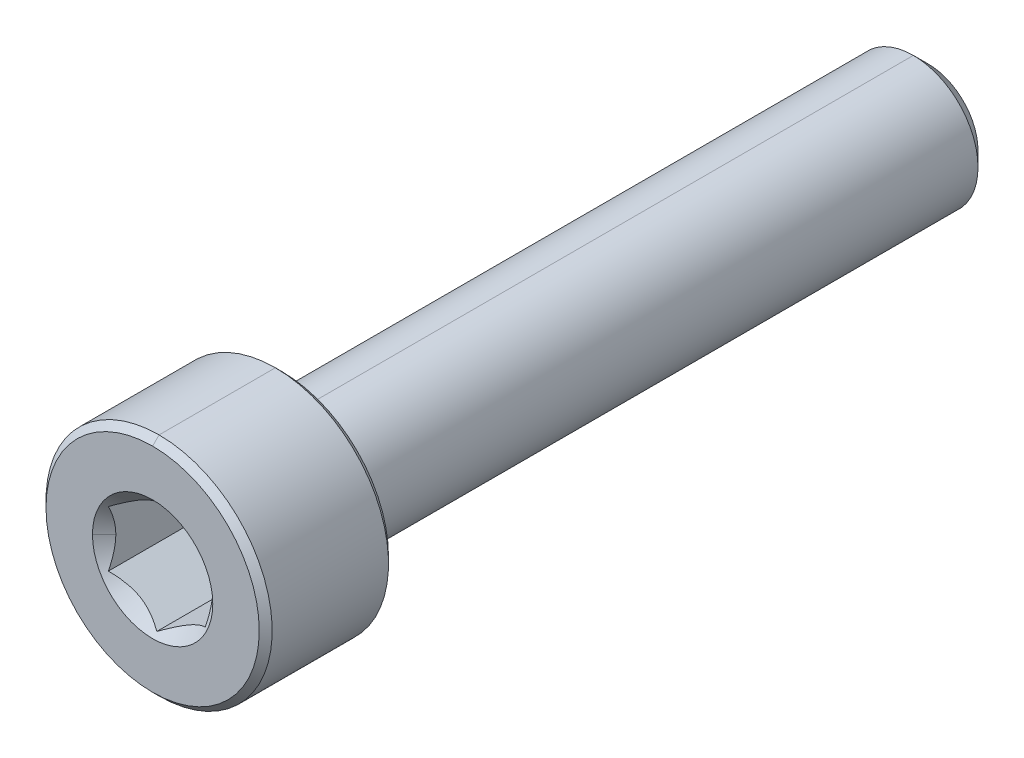
ISO-10303-21;
HEADER;
FILE_DESCRIPTION(('STEP AP214'),'2;1');
FILE_NAME('part.step','',(''),(''),'','','');
FILE_SCHEMA(('AUTOMOTIVE_DESIGN { 1 0 10303 214 1 1 1 1 }'));
ENDSEC;
DATA;
#1=APPLICATION_CONTEXT('core data for automotive mechanical design processes');
#2=APPLICATION_PROTOCOL_DEFINITION('international standard','automotive_design',2000,#1);
#3=PRODUCT_CONTEXT('',#1,'mechanical');
#4=PRODUCT('Part','Part','',(#3));
#5=PRODUCT_RELATED_PRODUCT_CATEGORY('part','',(#4));
#6=PRODUCT_DEFINITION_FORMATION('','',#4);
#7=PRODUCT_DEFINITION_CONTEXT('part definition',#1,'design');
#8=PRODUCT_DEFINITION('design','',#6,#7);
#9=PRODUCT_DEFINITION_SHAPE('','',#8);
#10=(LENGTH_UNIT() NAMED_UNIT(*) SI_UNIT(.MILLI.,.METRE.));
#11=(NAMED_UNIT(*) PLANE_ANGLE_UNIT() SI_UNIT($,.RADIAN.));
#12=(NAMED_UNIT(*) SI_UNIT($,.STERADIAN.) SOLID_ANGLE_UNIT());
#13=UNCERTAINTY_MEASURE_WITH_UNIT(LENGTH_MEASURE(1.E-05),#10,'distance_accuracy_value','');
#14=(GEOMETRIC_REPRESENTATION_CONTEXT(3) GLOBAL_UNCERTAINTY_ASSIGNED_CONTEXT((#13)) GLOBAL_UNIT_ASSIGNED_CONTEXT((#10,
#11,#12)) REPRESENTATION_CONTEXT('',''));
#15=CARTESIAN_POINT('',(0.,0.,0.));
#16=DIRECTION('',(0.,0.,1.));
#17=DIRECTION('',(1.,0.,0.));
#18=AXIS2_PLACEMENT_3D('',#15,#16,#17);
#19=CARTESIAN_POINT('',(1.5,-0.866025403784439,3.41742430504416));
#20=DIRECTION('',(1.,0.,0.));
#21=DIRECTION('',(0.,1.,0.));
#22=AXIS2_PLACEMENT_3D('',#19,#20,#21);
#23=PLANE('',#22);
#24=DIRECTION('',(0.,0.,1.));
#25=VECTOR('',#24,1.);
#26=CARTESIAN_POINT('',(1.5,-0.866025403784439,3.41742430504416));
#27=LINE('',#26,#25);
#28=CARTESIAN_POINT('',(1.5,-0.866025403784439,9.));
#29=VERTEX_POINT('',#28);
#30=CARTESIAN_POINT('',(1.5,-0.866025403784439,11.8700961894323));
#31=VERTEX_POINT('',#30);
#32=EDGE_CURVE('E280',#29,#31,#27,.T.);
#33=ORIENTED_EDGE('',*,*,#32,.T.);
#34=CARTESIAN_POINT('',(1.5,-0.866025403784439,11.8700961894323));
#35=CARTESIAN_POINT('',(1.5,-0.401923788646695,11.6380453818635));
#36=CARTESIAN_POINT('',(1.5,0.,11.6380453818635));
#37=B_SPLINE_CURVE_WITH_KNOTS('',2,(#34,#35,#36),.UNSPECIFIED.,.F.,.F.,(3,3),(0.,1.),.UNSPECIFIED.);
#38=CARTESIAN_POINT('',(1.5,0.,11.6380453818635));
#39=VERTEX_POINT('',#38);
#40=EDGE_CURVE('E343',#31,#39,#37,.T.);
#41=ORIENTED_EDGE('',*,*,#40,.T.);
#42=CARTESIAN_POINT('',(1.5,0.,11.6380453818635));
#43=CARTESIAN_POINT('',(1.5,0.216977558745861,11.6380453818635));
#44=CARTESIAN_POINT('',(1.5,0.445753418709853,11.7028763983924));
#45=CARTESIAN_POINT('',(1.5,0.643872918489836,11.759019946785));
#46=CARTESIAN_POINT('',(1.5,0.866025403784441,11.8700961894323));
#47=B_SPLINE_CURVE_WITH_KNOTS('',2,(#42,#43,#44,#45,#46),.UNSPECIFIED.,.F.,.F.,(3,2,3),(0.,0.5,
1.),.UNSPECIFIED.);
#48=CARTESIAN_POINT('',(1.5,0.866025403784439,11.8700961894323));
#49=VERTEX_POINT('',#48);
#50=EDGE_CURVE('E355',#39,#49,#47,.T.);
#51=ORIENTED_EDGE('',*,*,#50,.T.);
#52=DIRECTION('',(0.,0.,1.));
#53=VECTOR('',#52,1.);
#54=CARTESIAN_POINT('',(1.5,0.866025403784439,3.41742430504416));
#55=LINE('',#54,#53);
#56=CARTESIAN_POINT('',(1.5,0.866025403784439,9.));
#57=VERTEX_POINT('',#56);
#58=EDGE_CURVE('E10',#57,#49,#55,.T.);
#59=ORIENTED_EDGE('',*,*,#58,.F.);
#60=DIRECTION('',(0.,1.,0.));
#61=VECTOR('',#60,1.);
#62=CARTESIAN_POINT('',(1.5,-0.866025403784439,9.));
#63=LINE('',#62,#61);
#64=EDGE_CURVE('E852',#29,#57,#63,.T.);
#65=ORIENTED_EDGE('',*,*,#64,.F.);
#66=EDGE_LOOP('',(#33,#41,#51,#59,#65));
#67=FACE_BOUND('',#66,.T.);
#68=ADVANCED_FACE('F16',(#67),#23,.F.);
#69=CARTESIAN_POINT('',(1.5,0.866025403784439,3.41742430504416));
#70=DIRECTION('',(0.5,0.866025403784439,0.));
#71=DIRECTION('',(0.,0.,-1.));
#72=AXIS2_PLACEMENT_3D('',#69,#70,#71);
#73=PLANE('',#72);
#74=ORIENTED_EDGE('',*,*,#58,.T.);
#75=CARTESIAN_POINT('',(1.5,0.866025403784439,11.8700961894323));
#76=CARTESIAN_POINT('',(1.09983313245336,1.09706185248326,11.6390597407335));
#77=CARTESIAN_POINT('',(0.752762837135629,1.29744298091268,11.6380487744236));
#78=CARTESIAN_POINT('',(0.403679115743728,1.49898656142801,11.6370319432905));
#79=CARTESIAN_POINT('',(0.,1.73205080756888,11.8700961894323));
#80=B_SPLINE_CURVE_WITH_KNOTS('',2,(#75,#76,#77,#78,#79),.UNSPECIFIED.,.F.,.F.,(3,2,3),(0.,0.5,
1.),.UNSPECIFIED.);
#81=CARTESIAN_POINT('',(0.,1.73205080756888,11.8700961894323));
#82=VERTEX_POINT('',#81);
#83=EDGE_CURVE('E376',#49,#82,#80,.T.);
#84=ORIENTED_EDGE('',*,*,#83,.T.);
#85=DIRECTION('',(0.,0.,1.));
#86=VECTOR('',#85,1.);
#87=CARTESIAN_POINT('',(0.,1.73205080756888,3.41742430504416));
#88=LINE('',#87,#86);
#89=CARTESIAN_POINT('',(0.,1.73205080756887,9.));
#90=VERTEX_POINT('',#89);
#91=EDGE_CURVE('E28',#90,#82,#88,.T.);
#92=ORIENTED_EDGE('',*,*,#91,.F.);
#93=DIRECTION('',(-0.866025403784439,0.5,0.));
#94=VECTOR('',#93,1.);
#95=CARTESIAN_POINT('',(1.5,0.866025403784439,9.));
#96=LINE('',#95,#94);
#97=EDGE_CURVE('E848',#57,#90,#96,.T.);
#98=ORIENTED_EDGE('',*,*,#97,.F.);
#99=EDGE_LOOP('',(#74,#84,#92,#98));
#100=FACE_BOUND('',#99,.T.);
#101=ADVANCED_FACE('F380',(#100),#73,.F.);
#102=CARTESIAN_POINT('',(0.,1.73205080756888,3.41742430504416));
#103=DIRECTION('',(-0.5,0.866025403784438,0.));
#104=DIRECTION('',(0.,0.,1.));
#105=AXIS2_PLACEMENT_3D('',#102,#103,#104);
#106=PLANE('',#105);
#107=ORIENTED_EDGE('',*,*,#91,.T.);
#108=CARTESIAN_POINT('',(0.,1.73205080756888,11.8700961894323));
#109=CARTESIAN_POINT('',(-0.400166867551967,1.50101435886698,11.6390597407304));
#110=CARTESIAN_POINT('',(-0.747237162864371,1.30063323044064,11.6380487744236));
#111=CARTESIAN_POINT('',(-1.09632088426159,1.09908964992224,11.6370319432935));
#112=CARTESIAN_POINT('',(-1.5,0.866025403784442,11.8700961894323));
#113=B_SPLINE_CURVE_WITH_KNOTS('',2,(#108,#109,#110,#111,#112),.UNSPECIFIED.,.F.,.F.,(3,2,3),
(0.,0.5,1.),.UNSPECIFIED.);
#114=CARTESIAN_POINT('',(-1.5,0.866025403784438,11.8700961894323));
#115=VERTEX_POINT('',#114);
#116=EDGE_CURVE('E184',#82,#115,#113,.T.);
#117=ORIENTED_EDGE('',*,*,#116,.T.);
#118=DIRECTION('',(0.,0.,1.));
#119=VECTOR('',#118,1.);
#120=CARTESIAN_POINT('',(-1.5,0.866025403784438,3.41742430504416));
#121=LINE('',#120,#119);
#122=CARTESIAN_POINT('',(-1.5,0.866025403784438,9.));
#123=VERTEX_POINT('',#122);
#124=EDGE_CURVE('E53',#123,#115,#121,.T.);
#125=ORIENTED_EDGE('',*,*,#124,.F.);
#126=DIRECTION('',(-0.866025403784438,-0.5,0.));
#127=VECTOR('',#126,1.);
#128=CARTESIAN_POINT('',(0.,1.73205080756888,9.));
#129=LINE('',#128,#127);
#130=EDGE_CURVE('E844',#90,#123,#129,.T.);
#131=ORIENTED_EDGE('',*,*,#130,.F.);
#132=EDGE_LOOP('',(#107,#117,#125,#131));
#133=FACE_BOUND('',#132,.T.);
#134=ADVANCED_FACE('F218',(#133),#106,.F.);
#135=CARTESIAN_POINT('',(-1.5,0.866025403784438,3.41742430504416));
#136=DIRECTION('',(-1.,0.,0.));
#137=DIRECTION('',(0.,0.,1.));
#138=AXIS2_PLACEMENT_3D('',#135,#136,#137);
#139=PLANE('',#138);
#140=ORIENTED_EDGE('',*,*,#124,.T.);
#141=CARTESIAN_POINT('',(-1.5,0.866025403784438,11.8700961894323));
#142=CARTESIAN_POINT('',(-1.5,0.646596781722757,11.7603818784015));
#143=CARTESIAN_POINT('',(-1.5,0.445753418709853,11.7028763983924));
#144=CARTESIAN_POINT('',(-1.5,0.219324922066176,11.6380453818635));
#145=CARTESIAN_POINT('',(-1.5,0.,11.6380453818635));
#146=B_SPLINE_CURVE_WITH_KNOTS('',2,(#141,#142,#143,#144,#145),.UNSPECIFIED.,.F.,.F.,(3,2,3),
(0.,0.5,1.),.UNSPECIFIED.);
#147=CARTESIAN_POINT('',(-1.5,0.,11.6380453818635));
#148=VERTEX_POINT('',#147);
#149=EDGE_CURVE('E173',#115,#148,#146,.T.);
#150=ORIENTED_EDGE('',*,*,#149,.T.);
#151=CARTESIAN_POINT('',(-1.5,0.,11.6380453818635));
#152=CARTESIAN_POINT('',(-1.5,-0.401923788646694,11.6380453818635));
#153=CARTESIAN_POINT('',(-1.5,-0.866025403784437,11.8700961894323));
#154=B_SPLINE_CURVE_WITH_KNOTS('',2,(#151,#152,#153),.UNSPECIFIED.,.F.,.F.,(3,3),(0.,1.),.UNSPECIFIED.);
#155=CARTESIAN_POINT('',(-1.5,-0.866025403784439,11.8700961894323));
#156=VERTEX_POINT('',#155);
#157=EDGE_CURVE('E178',#148,#156,#154,.T.);
#158=ORIENTED_EDGE('',*,*,#157,.T.);
#159=DIRECTION('',(0.,0.,1.));
#160=VECTOR('',#159,1.);
#161=CARTESIAN_POINT('',(-1.5,-0.866025403784439,3.41742430504416));
#162=LINE('',#161,#160);
#163=CARTESIAN_POINT('',(-1.5,-0.866025403784439,9.));
#164=VERTEX_POINT('',#163);
#165=EDGE_CURVE('E42',#164,#156,#162,.T.);
#166=ORIENTED_EDGE('',*,*,#165,.F.);
#167=DIRECTION('',(0.,-1.,0.));
#168=VECTOR('',#167,1.);
#169=CARTESIAN_POINT('',(-1.5,0.866025403784438,9.));
#170=LINE('',#169,#168);
#171=EDGE_CURVE('E837',#123,#164,#170,.T.);
#172=ORIENTED_EDGE('',*,*,#171,.F.);
#173=EDGE_LOOP('',(#140,#150,#158,#166,#172));
#174=FACE_BOUND('',#173,.T.);
#175=ADVANCED_FACE('F176',(#174),#139,.F.);
#176=CARTESIAN_POINT('',(-1.5,-0.866025403784439,3.41742430504416));
#177=DIRECTION('',(-0.5,-0.866025403784439,0.));
#178=DIRECTION('',(-0.866025403784439,0.5,0.));
#179=AXIS2_PLACEMENT_3D('',#176,#177,#178);
#180=PLANE('',#179);
#181=ORIENTED_EDGE('',*,*,#165,.T.);
#182=CARTESIAN_POINT('',(-1.5,-0.866025403784439,11.8700961894323));
#183=CARTESIAN_POINT('',(-1.09983313245015,-1.09706185248511,11.6390597407317));
#184=CARTESIAN_POINT('',(-0.752762837135628,-1.29744298091268,11.6380487744236));
#185=CARTESIAN_POINT('',(-0.403679115740531,-1.49898656142985,11.6370319432923));
#186=CARTESIAN_POINT('',(0.,-1.73205080756888,11.8700961894323));
#187=B_SPLINE_CURVE_WITH_KNOTS('',2,(#182,#183,#184,#185,#186),.UNSPECIFIED.,.F.,.F.,(3,2,3),
(0.,0.5,1.),.UNSPECIFIED.);
#188=CARTESIAN_POINT('',(0.,-1.73205080756888,11.8700961894323));
#189=VERTEX_POINT('',#188);
#190=EDGE_CURVE('E202',#156,#189,#187,.T.);
#191=ORIENTED_EDGE('',*,*,#190,.T.);
#192=DIRECTION('',(0.,0.,1.));
#193=VECTOR('',#192,1.);
#194=CARTESIAN_POINT('',(0.,-1.73205080756888,3.41742430504416));
#195=LINE('',#194,#193);
#196=CARTESIAN_POINT('',(0.,-1.73205080756887,9.));
#197=VERTEX_POINT('',#196);
#198=EDGE_CURVE('E286',#197,#189,#195,.T.);
#199=ORIENTED_EDGE('',*,*,#198,.F.);
#200=DIRECTION('',(0.866025403784439,-0.5,0.));
#201=VECTOR('',#200,1.);
#202=CARTESIAN_POINT('',(-1.5,-0.866025403784439,9.));
#203=LINE('',#202,#201);
#204=EDGE_CURVE('E296',#164,#197,#203,.T.);
#205=ORIENTED_EDGE('',*,*,#204,.F.);
#206=EDGE_LOOP('',(#181,#191,#199,#205));
#207=FACE_BOUND('',#206,.T.);
#208=ADVANCED_FACE('F217',(#207),#180,.F.);
#209=CARTESIAN_POINT('',(0.,-1.73205080756888,3.41742430504416));
#210=DIRECTION('',(0.5,-0.866025403784439,0.));
#211=DIRECTION('',(0.,0.,-1.));
#212=AXIS2_PLACEMENT_3D('',#209,#210,#211);
#213=PLANE('',#212);
#214=ORIENTED_EDGE('',*,*,#198,.T.);
#215=CARTESIAN_POINT('',(0.,-1.73205080756888,11.8700961894323));
#216=CARTESIAN_POINT('',(0.40016686755412,-1.50101435886574,11.6390597407292));
#217=CARTESIAN_POINT('',(0.747237162864371,-1.30063323044064,11.6380487744236));
#218=CARTESIAN_POINT('',(1.09632088426374,-1.099089649921,11.6370319432948));
#219=CARTESIAN_POINT('',(1.5,-0.866025403784442,11.8700961894323));
#220=B_SPLINE_CURVE_WITH_KNOTS('',2,(#215,#216,#217,#218,#219),.UNSPECIFIED.,.F.,.F.,(3,2,3),
(0.,0.5,1.),.UNSPECIFIED.);
#221=EDGE_CURVE('E302',#189,#31,#220,.T.);
#222=ORIENTED_EDGE('',*,*,#221,.T.);
#223=ORIENTED_EDGE('',*,*,#32,.F.);
#224=DIRECTION('',(0.866025403784439,0.5,0.));
#225=VECTOR('',#224,1.);
#226=CARTESIAN_POINT('',(0.,-1.73205080756888,9.));
#227=LINE('',#226,#225);
#228=EDGE_CURVE('E864',#197,#29,#227,.T.);
#229=ORIENTED_EDGE('',*,*,#228,.F.);
#230=EDGE_LOOP('',(#214,#222,#223,#229));
#231=FACE_BOUND('',#230,.T.);
#232=ADVANCED_FACE('F246',(#231),#213,.F.);
#233=CARTESIAN_POINT('',(0.,3.3,9.));
#234=DIRECTION('',(0.,0.,-1.));
#235=DIRECTION('',(-1.,0.,0.));
#236=AXIS2_PLACEMENT_3D('',#233,#234,#235);
#237=PLANE('',#236);
#238=ORIENTED_EDGE('',*,*,#228,.T.);
#239=ORIENTED_EDGE('',*,*,#64,.T.);
#240=ORIENTED_EDGE('',*,*,#97,.T.);
#241=ORIENTED_EDGE('',*,*,#130,.T.);
#242=ORIENTED_EDGE('',*,*,#171,.T.);
#243=ORIENTED_EDGE('',*,*,#204,.T.);
#244=EDGE_LOOP('',(#238,#239,#240,#241,#242,#243));
#245=FACE_BOUND('',#244,.T.);
#246=ADVANCED_FACE('F244',(#245),#237,.F.);
#247=CARTESIAN_POINT('',(0.,0.,12.));
#248=DIRECTION('',(0.,0.,1.));
#249=DIRECTION('',(1.,0.,0.));
#250=AXIS2_PLACEMENT_3D('',#247,#248,#249);
#251=CONICAL_SURFACE('',#250,1.86195461813655,0.78539816339745);
#252=DIRECTION('',(-0.707106781186549,0.,0.707106781186546));
#253=VECTOR('',#252,1.);
#254=CARTESIAN_POINT('',(-1.86195461813655,0.,12.));
#255=LINE('',#254,#253);
#256=CARTESIAN_POINT('',(-1.86195461813655,0.,12.));
#257=VERTEX_POINT('',#256);
#258=EDGE_CURVE('E189',#148,#257,#255,.T.);
#259=ORIENTED_EDGE('',*,*,#258,.F.);
#260=ORIENTED_EDGE('',*,*,#149,.F.);
#261=ORIENTED_EDGE('',*,*,#116,.F.);
#262=ORIENTED_EDGE('',*,*,#83,.F.);
#263=ORIENTED_EDGE('',*,*,#50,.F.);
#264=DIRECTION('',(0.707106781186549,0.,0.707106781186546));
#265=VECTOR('',#264,1.);
#266=CARTESIAN_POINT('',(1.86195461813655,0.,12.));
#267=LINE('',#266,#265);
#268=CARTESIAN_POINT('',(1.86195461813655,0.,12.));
#269=VERTEX_POINT('',#268);
#270=EDGE_CURVE('E360',#39,#269,#267,.T.);
#271=ORIENTED_EDGE('',*,*,#270,.T.);
#272=CARTESIAN_POINT('',(0.,0.,12.));
#273=DIRECTION('',(0.,0.,1.));
#274=DIRECTION('',(1.,0.,0.));
#275=AXIS2_PLACEMENT_3D('',#272,#273,#274);
#276=CIRCLE('',#275,1.86195461813655);
#277=EDGE_CURVE('E185',#269,#257,#276,.T.);
#278=ORIENTED_EDGE('',*,*,#277,.T.);
#279=EDGE_LOOP('',(#259,#260,#261,#262,#263,#271,#278));
#280=FACE_BOUND('',#279,.T.);
#281=ADVANCED_FACE('F190',(#280),#251,.F.);
#282=CARTESIAN_POINT('',(0.,0.,12.));
#283=DIRECTION('',(0.,0.,1.));
#284=DIRECTION('',(0.,-1.,0.));
#285=AXIS2_PLACEMENT_3D('',#282,#283,#284);
#286=PLANE('',#285);
#287=ORIENTED_EDGE('',*,*,#277,.F.);
#288=CARTESIAN_POINT('',(0.,0.,12.));
#289=DIRECTION('',(0.,0.,1.));
#290=DIRECTION('',(1.,0.,0.));
#291=AXIS2_PLACEMENT_3D('',#288,#289,#290);
#292=CIRCLE('',#291,1.86195461813655);
#293=EDGE_CURVE('E196',#257,#269,#292,.T.);
#294=ORIENTED_EDGE('',*,*,#293,.F.);
#295=EDGE_LOOP('',(#287,#294));
#296=FACE_BOUND('',#295,.T.);
#297=CARTESIAN_POINT('',(0.,0.,12.));
#298=DIRECTION('',(0.,0.,-1.));
#299=DIRECTION('',(0.,1.,0.));
#300=AXIS2_PLACEMENT_3D('',#297,#298,#299);
#301=CIRCLE('',#300,3.3);
#302=CARTESIAN_POINT('',(0.,3.3,12.));
#303=VERTEX_POINT('',#302);
#304=CARTESIAN_POINT('',(0.,-3.3,12.));
#305=VERTEX_POINT('',#304);
#306=EDGE_CURVE('E1016',#303,#305,#301,.T.);
#307=ORIENTED_EDGE('',*,*,#306,.F.);
#308=CARTESIAN_POINT('',(0.,0.,12.));
#309=DIRECTION('',(0.,0.,-1.));
#310=DIRECTION('',(0.,1.,0.));
#311=AXIS2_PLACEMENT_3D('',#308,#309,#310);
#312=CIRCLE('',#311,3.3);
#313=EDGE_CURVE('E874',#305,#303,#312,.T.);
#314=ORIENTED_EDGE('',*,*,#313,.F.);
#315=EDGE_LOOP('',(#307,#314));
#316=FACE_BOUND('',#315,.T.);
#317=ADVANCED_FACE('F243',(#296,#316),#286,.T.);
#318=CARTESIAN_POINT('',(0.,0.,11.8));
#319=DIRECTION('',(0.,0.,-1.));
#320=DIRECTION('',(0.,1.,0.));
#321=AXIS2_PLACEMENT_3D('',#318,#319,#320);
#322=CONICAL_SURFACE('',#321,3.5,0.785398163397452);
#323=DIRECTION('',(0.,-0.70710678118655,-0.707106781186545));
#324=VECTOR('',#323,1.);
#325=CARTESIAN_POINT('',(0.,-3.5,11.8));
#326=LINE('',#325,#324);
#327=CARTESIAN_POINT('',(0.,-3.5,11.8));
#328=VERTEX_POINT('',#327);
#329=EDGE_CURVE('E1020',#305,#328,#326,.T.);
#330=ORIENTED_EDGE('',*,*,#329,.F.);
#331=ORIENTED_EDGE('',*,*,#313,.T.);
#332=DIRECTION('',(0.,0.70710678118655,-0.707106781186545));
#333=VECTOR('',#332,1.);
#334=CARTESIAN_POINT('',(0.,3.5,11.8));
#335=LINE('',#334,#333);
#336=CARTESIAN_POINT('',(0.,3.5,11.8));
#337=VERTEX_POINT('',#336);
#338=EDGE_CURVE('E1006',#303,#337,#335,.T.);
#339=ORIENTED_EDGE('',*,*,#338,.T.);
#340=CARTESIAN_POINT('',(0.,0.,11.8));
#341=DIRECTION('',(0.,0.,-1.));
#342=DIRECTION('',(0.,1.,0.));
#343=AXIS2_PLACEMENT_3D('',#340,#341,#342);
#344=CIRCLE('',#343,3.5);
#345=EDGE_CURVE('E877',#328,#337,#344,.T.);
#346=ORIENTED_EDGE('',*,*,#345,.F.);
#347=EDGE_LOOP('',(#330,#331,#339,#346));
#348=FACE_BOUND('',#347,.T.);
#349=ADVANCED_FACE('F406',(#348),#322,.T.);
#350=CARTESIAN_POINT('',(0.,0.,-12.));
#351=DIRECTION('',(0.,0.,-1.));
#352=DIRECTION('',(0.,1.,0.));
#353=AXIS2_PLACEMENT_3D('',#350,#351,#352);
#354=CYLINDRICAL_SURFACE('',#353,3.5);
#355=DIRECTION('',(0.,0.,-1.));
#356=VECTOR('',#355,1.);
#357=CARTESIAN_POINT('',(0.,-3.5,-12.));
#358=LINE('',#357,#356);
#359=CARTESIAN_POINT('',(0.,-3.5,8.2));
#360=VERTEX_POINT('',#359);
#361=EDGE_CURVE('E1001',#328,#360,#358,.T.);
#362=ORIENTED_EDGE('',*,*,#361,.F.);
#363=ORIENTED_EDGE('',*,*,#345,.T.);
#364=DIRECTION('',(0.,0.,-1.));
#365=VECTOR('',#364,1.);
#366=CARTESIAN_POINT('',(0.,3.5,-12.));
#367=LINE('',#366,#365);
#368=CARTESIAN_POINT('',(0.,3.5,8.2));
#369=VERTEX_POINT('',#368);
#370=EDGE_CURVE('E997',#337,#369,#367,.T.);
#371=ORIENTED_EDGE('',*,*,#370,.T.);
#372=CARTESIAN_POINT('',(0.,0.,8.2));
#373=DIRECTION('',(0.,0.,-1.));
#374=DIRECTION('',(0.,1.,0.));
#375=AXIS2_PLACEMENT_3D('',#372,#373,#374);
#376=CIRCLE('',#375,3.5);
#377=EDGE_CURVE('E883',#360,#369,#376,.T.);
#378=ORIENTED_EDGE('',*,*,#377,.F.);
#379=EDGE_LOOP('',(#362,#363,#371,#378));
#380=FACE_BOUND('',#379,.T.);
#381=ADVANCED_FACE('F402',(#380),#354,.T.);
#382=CARTESIAN_POINT('',(0.,0.,8.));
#383=DIRECTION('',(0.,0.,1.));
#384=DIRECTION('',(0.,-1.,0.));
#385=AXIS2_PLACEMENT_3D('',#382,#383,#384);
#386=CONICAL_SURFACE('',#385,3.3,0.785398163397443);
#387=DIRECTION('',(0.,0.707106781186544,0.707106781186552));
#388=VECTOR('',#387,1.);
#389=CARTESIAN_POINT('',(0.,3.3,8.));
#390=LINE('',#389,#388);
#391=CARTESIAN_POINT('',(0.,3.3,8.));
#392=VERTEX_POINT('',#391);
#393=EDGE_CURVE('E989',#392,#369,#390,.T.);
#394=ORIENTED_EDGE('',*,*,#393,.F.);
#395=CARTESIAN_POINT('',(0.,0.,8.));
#396=DIRECTION('',(0.,0.,-1.));
#397=DIRECTION('',(0.,1.,0.));
#398=AXIS2_PLACEMENT_3D('',#395,#396,#397);
#399=CIRCLE('',#398,3.3);
#400=CARTESIAN_POINT('',(0.,-3.3,8.));
#401=VERTEX_POINT('',#400);
#402=EDGE_CURVE('E889',#401,#392,#399,.T.);
#403=ORIENTED_EDGE('',*,*,#402,.F.);
#404=DIRECTION('',(0.,-0.707106781186544,0.707106781186552));
#405=VECTOR('',#404,1.);
#406=CARTESIAN_POINT('',(0.,-3.3,8.));
#407=LINE('',#406,#405);
#408=EDGE_CURVE('E982',#401,#360,#407,.T.);
#409=ORIENTED_EDGE('',*,*,#408,.T.);
#410=ORIENTED_EDGE('',*,*,#377,.T.);
#411=EDGE_LOOP('',(#394,#403,#409,#410));
#412=FACE_BOUND('',#411,.T.);
#413=ADVANCED_FACE('F405',(#412),#386,.T.);
#414=CARTESIAN_POINT('',(0.,3.3,8.));
#415=DIRECTION('',(0.,0.,-1.));
#416=DIRECTION('',(-1.,0.,0.));
#417=AXIS2_PLACEMENT_3D('',#414,#415,#416);
#418=PLANE('',#417);
#419=CARTESIAN_POINT('',(0.,0.,8.));
#420=DIRECTION('',(0.,0.,-1.));
#421=DIRECTION('',(0.,1.,0.));
#422=AXIS2_PLACEMENT_3D('',#419,#420,#421);
#423=CIRCLE('',#422,2.2);
#424=CARTESIAN_POINT('',(0.,2.2,8.));
#425=VERTEX_POINT('',#424);
#426=CARTESIAN_POINT('',(0.,-2.2,8.));
#427=VERTEX_POINT('',#426);
#428=EDGE_CURVE('E895',#425,#427,#423,.T.);
#429=ORIENTED_EDGE('',*,*,#428,.F.);
#430=CARTESIAN_POINT('',(0.,0.,8.));
#431=DIRECTION('',(0.,0.,-1.));
#432=DIRECTION('',(0.,1.,0.));
#433=AXIS2_PLACEMENT_3D('',#430,#431,#432);
#434=CIRCLE('',#433,2.2);
#435=EDGE_CURVE('E967',#427,#425,#434,.T.);
#436=ORIENTED_EDGE('',*,*,#435,.F.);
#437=EDGE_LOOP('',(#429,#436));
#438=FACE_BOUND('',#437,.T.);
#439=ORIENTED_EDGE('',*,*,#402,.T.);
#440=CARTESIAN_POINT('',(0.,0.,8.));
#441=DIRECTION('',(0.,0.,-1.));
#442=DIRECTION('',(0.,1.,0.));
#443=AXIS2_PLACEMENT_3D('',#440,#441,#442);
#444=CIRCLE('',#443,3.3);
#445=EDGE_CURVE('E993',#392,#401,#444,.T.);
#446=ORIENTED_EDGE('',*,*,#445,.T.);
#447=EDGE_LOOP('',(#439,#446));
#448=FACE_BOUND('',#447,.T.);
#449=ADVANCED_FACE('F408',(#438,#448),#418,.T.);
#450=CARTESIAN_POINT('',(0.,0.,7.8));
#451=DIRECTION('',(0.,0.,-1.));
#452=DIRECTION('',(0.,1.,0.));
#453=AXIS2_PLACEMENT_3D('',#450,#451,#452);
#454=TOROIDAL_SURFACE('',#453,2.2,0.2);
#455=CARTESIAN_POINT('',(0.,-2.2,7.8));
#456=DIRECTION('',(1.,0.,0.));
#457=DIRECTION('',(0.,1.,0.));
#458=AXIS2_PLACEMENT_3D('',#455,#456,#457);
#459=CIRCLE('',#458,0.2);
#460=CARTESIAN_POINT('',(0.,-2.,7.8));
#461=VERTEX_POINT('',#460);
#462=EDGE_CURVE('E971',#461,#427,#459,.T.);
#463=ORIENTED_EDGE('',*,*,#462,.F.);
#464=CARTESIAN_POINT('',(0.,0.,7.8));
#465=DIRECTION('',(0.,0.,-1.));
#466=DIRECTION('',(0.,1.,0.));
#467=AXIS2_PLACEMENT_3D('',#464,#465,#466);
#468=CIRCLE('',#467,2.);
#469=CARTESIAN_POINT('',(0.,2.,7.8));
#470=VERTEX_POINT('',#469);
#471=EDGE_CURVE('E953',#470,#461,#468,.T.);
#472=ORIENTED_EDGE('',*,*,#471,.F.);
#473=CARTESIAN_POINT('',(0.,2.2,7.8));
#474=DIRECTION('',(-1.,0.,0.));
#475=DIRECTION('',(0.,0.,1.));
#476=AXIS2_PLACEMENT_3D('',#473,#474,#475);
#477=CIRCLE('',#476,0.2);
#478=EDGE_CURVE('E960',#470,#425,#477,.T.);
#479=ORIENTED_EDGE('',*,*,#478,.T.);
#480=ORIENTED_EDGE('',*,*,#428,.T.);
#481=EDGE_LOOP('',(#463,#472,#479,#480));
#482=FACE_BOUND('',#481,.T.);
#483=ADVANCED_FACE('F411',(#482),#454,.F.);
#484=CARTESIAN_POINT('',(0.,0.,-12.));
#485=DIRECTION('',(0.,0.,-1.));
#486=DIRECTION('',(0.,1.,0.));
#487=AXIS2_PLACEMENT_3D('',#484,#485,#486);
#488=CYLINDRICAL_SURFACE('',#487,2.);
#489=DIRECTION('',(0.,0.,-1.));
#490=VECTOR('',#489,1.);
#491=CARTESIAN_POINT('',(0.,-2.,-12.));
#492=LINE('',#491,#490);
#493=CARTESIAN_POINT('',(0.,-2.,-11.5453366630132));
#494=VERTEX_POINT('',#493);
#495=EDGE_CURVE('E946',#461,#494,#492,.T.);
#496=ORIENTED_EDGE('',*,*,#495,.F.);
#497=CARTESIAN_POINT('',(0.,0.,7.8));
#498=DIRECTION('',(0.,0.,-1.));
#499=DIRECTION('',(0.,1.,0.));
#500=AXIS2_PLACEMENT_3D('',#497,#498,#499);
#501=CIRCLE('',#500,2.);
#502=EDGE_CURVE('E975',#461,#470,#501,.T.);
#503=ORIENTED_EDGE('',*,*,#502,.T.);
#504=DIRECTION('',(0.,0.,-1.));
#505=VECTOR('',#504,1.);
#506=CARTESIAN_POINT('',(0.,2.,-12.));
#507=LINE('',#506,#505);
#508=CARTESIAN_POINT('',(0.,2.,-11.5453366630132));
#509=VERTEX_POINT('',#508);
#510=EDGE_CURVE('E932',#470,#509,#507,.T.);
#511=ORIENTED_EDGE('',*,*,#510,.T.);
#512=CARTESIAN_POINT('',(0.,0.,-11.5453366630132));
#513=DIRECTION('',(0.,0.,-1.));
#514=DIRECTION('',(0.,1.,0.));
#515=AXIS2_PLACEMENT_3D('',#512,#513,#514);
#516=CIRCLE('',#515,2.);
#517=EDGE_CURVE('E901',#494,#509,#516,.T.);
#518=ORIENTED_EDGE('',*,*,#517,.F.);
#519=EDGE_LOOP('',(#496,#503,#511,#518));
#520=FACE_BOUND('',#519,.T.);
#521=ADVANCED_FACE('F327',(#520),#488,.T.);
#522=CARTESIAN_POINT('',(0.,0.,-12.));
#523=DIRECTION('',(0.,0.,1.));
#524=DIRECTION('',(0.,-1.,0.));
#525=AXIS2_PLACEMENT_3D('',#522,#523,#524);
#526=CONICAL_SURFACE('',#525,1.54533666301317,0.785398163397446);
#527=DIRECTION('',(0.,0.707106781186546,0.707106781186549));
#528=VECTOR('',#527,1.);
#529=CARTESIAN_POINT('',(0.,1.54533666301317,-12.));
#530=LINE('',#529,#528);
#531=CARTESIAN_POINT('',(0.,1.54533666301317,-12.));
#532=VERTEX_POINT('',#531);
#533=EDGE_CURVE('E921',#532,#509,#530,.T.);
#534=ORIENTED_EDGE('',*,*,#533,.F.);
#535=CARTESIAN_POINT('',(0.,0.,-12.));
#536=DIRECTION('',(0.,0.,-1.));
#537=DIRECTION('',(0.,1.,0.));
#538=AXIS2_PLACEMENT_3D('',#535,#536,#537);
#539=CIRCLE('',#538,1.54533666301317);
#540=CARTESIAN_POINT('',(0.,-1.54533666301317,-12.));
#541=VERTEX_POINT('',#540);
#542=EDGE_CURVE('E911',#541,#532,#539,.T.);
#543=ORIENTED_EDGE('',*,*,#542,.F.);
#544=DIRECTION('',(0.,-0.707106781186546,0.707106781186549));
#545=VECTOR('',#544,1.);
#546=CARTESIAN_POINT('',(0.,-1.54533666301317,-12.));
#547=LINE('',#546,#545);
#548=EDGE_CURVE('E917',#541,#494,#547,.T.);
#549=ORIENTED_EDGE('',*,*,#548,.T.);
#550=ORIENTED_EDGE('',*,*,#517,.T.);
#551=EDGE_LOOP('',(#534,#543,#549,#550));
#552=FACE_BOUND('',#551,.T.);
#553=ADVANCED_FACE('F400',(#552),#526,.T.);
#554=CARTESIAN_POINT('',(0.,1.54533666301317,-12.));
#555=DIRECTION('',(0.,0.,-1.));
#556=DIRECTION('',(-1.,0.,0.));
#557=AXIS2_PLACEMENT_3D('',#554,#555,#556);
#558=PLANE('',#557);
#559=ORIENTED_EDGE('',*,*,#542,.T.);
#560=CARTESIAN_POINT('',(0.,0.,-12.));
#561=DIRECTION('',(0.,0.,-1.));
#562=DIRECTION('',(0.,1.,0.));
#563=AXIS2_PLACEMENT_3D('',#560,#561,#562);
#564=CIRCLE('',#563,1.54533666301317);
#565=EDGE_CURVE('E925',#532,#541,#564,.T.);
#566=ORIENTED_EDGE('',*,*,#565,.T.);
#567=EDGE_LOOP('',(#559,#566));
#568=FACE_BOUND('',#567,.T.);
#569=ADVANCED_FACE('F396',(#568),#558,.T.);
#570=CARTESIAN_POINT('',(0.,0.,-12.));
#571=DIRECTION('',(0.,0.,1.));
#572=DIRECTION('',(0.,-1.,0.));
#573=AXIS2_PLACEMENT_3D('',#570,#571,#572);
#574=CONICAL_SURFACE('',#573,1.54533666301317,0.785398163397446);
#575=ORIENTED_EDGE('',*,*,#565,.F.);
#576=ORIENTED_EDGE('',*,*,#533,.T.);
#577=CARTESIAN_POINT('',(0.,0.,-11.5453366630132));
#578=DIRECTION('',(0.,0.,-1.));
#579=DIRECTION('',(0.,1.,0.));
#580=AXIS2_PLACEMENT_3D('',#577,#578,#579);
#581=CIRCLE('',#580,2.);
#582=EDGE_CURVE('E939',#509,#494,#581,.T.);
#583=ORIENTED_EDGE('',*,*,#582,.T.);
#584=ORIENTED_EDGE('',*,*,#548,.F.);
#585=EDGE_LOOP('',(#575,#576,#583,#584));
#586=FACE_BOUND('',#585,.T.);
#587=ADVANCED_FACE('F392',(#586),#574,.T.);
#588=CARTESIAN_POINT('',(0.,0.,-12.));
#589=DIRECTION('',(0.,0.,-1.));
#590=DIRECTION('',(0.,1.,0.));
#591=AXIS2_PLACEMENT_3D('',#588,#589,#590);
#592=CYLINDRICAL_SURFACE('',#591,2.);
#593=ORIENTED_EDGE('',*,*,#471,.T.);
#594=ORIENTED_EDGE('',*,*,#495,.T.);
#595=ORIENTED_EDGE('',*,*,#582,.F.);
#596=ORIENTED_EDGE('',*,*,#510,.F.);
#597=EDGE_LOOP('',(#593,#594,#595,#596));
#598=FACE_BOUND('',#597,.T.);
#599=ADVANCED_FACE('F395',(#598),#592,.T.);
#600=CARTESIAN_POINT('',(0.,0.,7.8));
#601=DIRECTION('',(0.,0.,-1.));
#602=DIRECTION('',(0.,1.,0.));
#603=AXIS2_PLACEMENT_3D('',#600,#601,#602);
#604=TOROIDAL_SURFACE('',#603,2.2,0.2);
#605=ORIENTED_EDGE('',*,*,#502,.F.);
#606=ORIENTED_EDGE('',*,*,#462,.T.);
#607=ORIENTED_EDGE('',*,*,#435,.T.);
#608=ORIENTED_EDGE('',*,*,#478,.F.);
#609=EDGE_LOOP('',(#605,#606,#607,#608));
#610=FACE_BOUND('',#609,.T.);
#611=ADVANCED_FACE('F390',(#610),#604,.F.);
#612=CARTESIAN_POINT('',(0.,0.,8.));
#613=DIRECTION('',(0.,0.,1.));
#614=DIRECTION('',(0.,-1.,0.));
#615=AXIS2_PLACEMENT_3D('',#612,#613,#614);
#616=CONICAL_SURFACE('',#615,3.3,0.785398163397443);
#617=ORIENTED_EDGE('',*,*,#445,.F.);
#618=ORIENTED_EDGE('',*,*,#393,.T.);
#619=CARTESIAN_POINT('',(0.,0.,8.2));
#620=DIRECTION('',(0.,0.,-1.));
#621=DIRECTION('',(0.,1.,0.));
#622=AXIS2_PLACEMENT_3D('',#619,#620,#621);
#623=CIRCLE('',#622,3.5);
#624=EDGE_CURVE('E1005',#369,#360,#623,.T.);
#625=ORIENTED_EDGE('',*,*,#624,.T.);
#626=ORIENTED_EDGE('',*,*,#408,.F.);
#627=EDGE_LOOP('',(#617,#618,#625,#626));
#628=FACE_BOUND('',#627,.T.);
#629=ADVANCED_FACE('F555',(#628),#616,.T.);
#630=CARTESIAN_POINT('',(0.,0.,-12.));
#631=DIRECTION('',(0.,0.,-1.));
#632=DIRECTION('',(0.,1.,0.));
#633=AXIS2_PLACEMENT_3D('',#630,#631,#632);
#634=CYLINDRICAL_SURFACE('',#633,3.5);
#635=CARTESIAN_POINT('',(0.,0.,11.8));
#636=DIRECTION('',(0.,0.,-1.));
#637=DIRECTION('',(0.,1.,0.));
#638=AXIS2_PLACEMENT_3D('',#635,#636,#637);
#639=CIRCLE('',#638,3.5);
#640=EDGE_CURVE('E1038',#337,#328,#639,.T.);
#641=ORIENTED_EDGE('',*,*,#640,.T.);
#642=ORIENTED_EDGE('',*,*,#361,.T.);
#643=ORIENTED_EDGE('',*,*,#624,.F.);
#644=ORIENTED_EDGE('',*,*,#370,.F.);
#645=EDGE_LOOP('',(#641,#642,#643,#644));
#646=FACE_BOUND('',#645,.T.);
#647=ADVANCED_FACE('F565',(#646),#634,.T.);
#648=CARTESIAN_POINT('',(0.,0.,11.8));
#649=DIRECTION('',(0.,0.,-1.));
#650=DIRECTION('',(0.,1.,0.));
#651=AXIS2_PLACEMENT_3D('',#648,#649,#650);
#652=CONICAL_SURFACE('',#651,3.5,0.785398163397452);
#653=ORIENTED_EDGE('',*,*,#306,.T.);
#654=ORIENTED_EDGE('',*,*,#329,.T.);
#655=ORIENTED_EDGE('',*,*,#640,.F.);
#656=ORIENTED_EDGE('',*,*,#338,.F.);
#657=EDGE_LOOP('',(#653,#654,#655,#656));
#658=FACE_BOUND('',#657,.T.);
#659=ADVANCED_FACE('F325',(#658),#652,.T.);
#660=CARTESIAN_POINT('',(0.,0.,12.));
#661=DIRECTION('',(0.,0.,1.));
#662=DIRECTION('',(1.,0.,0.));
#663=AXIS2_PLACEMENT_3D('',#660,#661,#662);
#664=CONICAL_SURFACE('',#663,1.86195461813655,0.78539816339745);
#665=ORIENTED_EDGE('',*,*,#157,.F.);
#666=ORIENTED_EDGE('',*,*,#258,.T.);
#667=ORIENTED_EDGE('',*,*,#293,.T.);
#668=ORIENTED_EDGE('',*,*,#270,.F.);
#669=ORIENTED_EDGE('',*,*,#40,.F.);
#670=ORIENTED_EDGE('',*,*,#221,.F.);
#671=ORIENTED_EDGE('',*,*,#190,.F.);
#672=EDGE_LOOP('',(#665,#666,#667,#668,#669,#670,#671));
#673=FACE_BOUND('',#672,.T.);
#674=ADVANCED_FACE('F199',(#673),#664,.F.);
#675=CLOSED_SHELL('',(#68,#101,#134,#175,#208,#232,#246,#281,#317,#349,#381,#413,#449,#483,#521,
#553,#569,#587,#599,#611,#629,#647,#659,#674));
#676=MANIFOLD_SOLID_BREP('B1',#675);
#677=ADVANCED_BREP_SHAPE_REPRESENTATION('',(#18,#676),#14);
#678=SHAPE_DEFINITION_REPRESENTATION(#9,#677);
ENDSEC;
END-ISO-10303-21;
